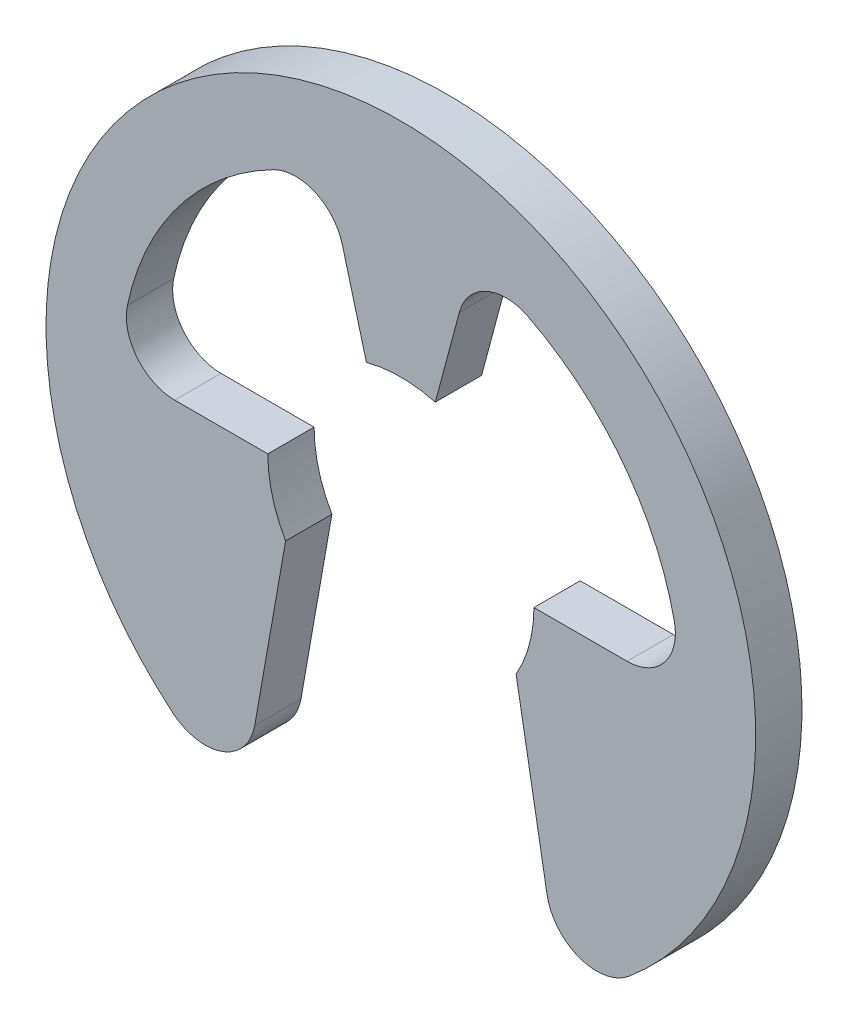
ISO-10303-21;
HEADER;
FILE_DESCRIPTION(('STEP AP214'),'2;1');
FILE_NAME('part.step','',(''),(''),'','','');
FILE_SCHEMA(('AUTOMOTIVE_DESIGN { 1 0 10303 214 1 1 1 1 }'));
ENDSEC;
DATA;
#1=APPLICATION_CONTEXT('core data for automotive mechanical design processes');
#2=APPLICATION_PROTOCOL_DEFINITION('international standard','automotive_design',2000,#1);
#3=PRODUCT_CONTEXT('',#1,'mechanical');
#4=PRODUCT('Part','Part','',(#3));
#5=PRODUCT_RELATED_PRODUCT_CATEGORY('part','',(#4));
#6=PRODUCT_DEFINITION_FORMATION('','',#4);
#7=PRODUCT_DEFINITION_CONTEXT('part definition',#1,'design');
#8=PRODUCT_DEFINITION('design','',#6,#7);
#9=PRODUCT_DEFINITION_SHAPE('','',#8);
#10=(LENGTH_UNIT() NAMED_UNIT(*) SI_UNIT(.MILLI.,.METRE.));
#11=(NAMED_UNIT(*) PLANE_ANGLE_UNIT() SI_UNIT($,.RADIAN.));
#12=(NAMED_UNIT(*) SI_UNIT($,.STERADIAN.) SOLID_ANGLE_UNIT());
#13=UNCERTAINTY_MEASURE_WITH_UNIT(LENGTH_MEASURE(1.E-05),#10,'distance_accuracy_value','');
#14=(GEOMETRIC_REPRESENTATION_CONTEXT(3) GLOBAL_UNCERTAINTY_ASSIGNED_CONTEXT((#13)) GLOBAL_UNIT_ASSIGNED_CONTEXT((#10,
#11,#12)) REPRESENTATION_CONTEXT('',''));
#15=CARTESIAN_POINT('',(0.,0.,0.));
#16=DIRECTION('',(0.,0.,1.));
#17=DIRECTION('',(1.,0.,0.));
#18=AXIS2_PLACEMENT_3D('',#15,#16,#17);
#19=CARTESIAN_POINT('',(1.95446781617003,0.418,-0.4));
#20=DIRECTION('',(0.,0.,1.));
#21=DIRECTION('',(1.,0.,0.));
#22=AXIS2_PLACEMENT_3D('',#19,#20,#21);
#23=CYLINDRICAL_SURFACE('',#22,0.418);
#24=CARTESIAN_POINT('',(1.95446781617003,0.418,0.));
#25=DIRECTION('',(0.,0.,-1.));
#26=DIRECTION('',(1.,0.,0.));
#27=AXIS2_PLACEMENT_3D('',#24,#25,#26);
#28=CIRCLE('',#27,0.418);
#29=CARTESIAN_POINT('',(2.36322409393474,0.505420280186791,0.));
#30=VERTEX_POINT('',#29);
#31=CARTESIAN_POINT('',(1.95446781617003,0.,0.));
#32=VERTEX_POINT('',#31);
#33=EDGE_CURVE('E189',#30,#32,#28,.T.);
#34=ORIENTED_EDGE('',*,*,#33,.F.);
#35=DIRECTION('',(0.,0.,1.));
#36=VECTOR('',#35,1.);
#37=CARTESIAN_POINT('',(2.36322409393474,0.505420280186791,-0.4));
#38=LINE('',#37,#36);
#39=CARTESIAN_POINT('',(2.36322409393474,0.505420280186791,-0.4));
#40=VERTEX_POINT('',#39);
#41=EDGE_CURVE('E11',#40,#30,#38,.T.);
#42=ORIENTED_EDGE('',*,*,#41,.F.);
#43=CARTESIAN_POINT('',(1.95446781617003,0.418,-0.4));
#44=DIRECTION('',(0.,0.,-1.));
#45=DIRECTION('',(1.,0.,0.));
#46=AXIS2_PLACEMENT_3D('',#43,#44,#45);
#47=CIRCLE('',#46,0.418);
#48=CARTESIAN_POINT('',(1.95446781617003,0.,-0.4));
#49=VERTEX_POINT('',#48);
#50=EDGE_CURVE('E239',#40,#49,#47,.T.);
#51=ORIENTED_EDGE('',*,*,#50,.T.);
#52=DIRECTION('',(0.,0.,1.));
#53=VECTOR('',#52,1.);
#54=CARTESIAN_POINT('',(1.95446781617003,0.,-0.4));
#55=LINE('',#54,#53);
#56=EDGE_CURVE('E35',#49,#32,#55,.T.);
#57=ORIENTED_EDGE('',*,*,#56,.T.);
#58=EDGE_LOOP('',(#34,#42,#51,#57));
#59=FACE_BOUND('',#58,.T.);
#60=ADVANCED_FACE('F32',(#59),#23,.F.);
#61=CARTESIAN_POINT('',(0.,0.,-0.4));
#62=DIRECTION('',(0.,0.,1.));
#63=DIRECTION('',(1.,0.,0.));
#64=AXIS2_PLACEMENT_3D('',#61,#62,#63);
#65=CYLINDRICAL_SURFACE('',#64,2.41666666666667);
#66=CARTESIAN_POINT('',(0.,0.,0.));
#67=DIRECTION('',(0.,0.,-1.));
#68=DIRECTION('',(1.,0.,0.));
#69=AXIS2_PLACEMENT_3D('',#66,#67,#68);
#70=CIRCLE('',#69,2.41666666666667);
#71=CARTESIAN_POINT('',(1.09984590511814,2.15188679134675,0.));
#72=VERTEX_POINT('',#71);
#73=EDGE_CURVE('E237',#72,#30,#70,.T.);
#74=ORIENTED_EDGE('',*,*,#73,.F.);
#75=DIRECTION('',(0.,0.,1.));
#76=VECTOR('',#75,1.);
#77=CARTESIAN_POINT('',(1.09984590511814,2.15188679134675,-0.4));
#78=LINE('',#77,#76);
#79=CARTESIAN_POINT('',(1.09984590511814,2.15188679134675,-0.4));
#80=VERTEX_POINT('',#79);
#81=EDGE_CURVE('E41',#80,#72,#78,.T.);
#82=ORIENTED_EDGE('',*,*,#81,.F.);
#83=CARTESIAN_POINT('',(0.,0.,-0.4));
#84=DIRECTION('',(0.,0.,-1.));
#85=DIRECTION('',(1.,0.,0.));
#86=AXIS2_PLACEMENT_3D('',#83,#84,#85);
#87=CIRCLE('',#86,2.41666666666667);
#88=EDGE_CURVE('E179',#80,#40,#87,.T.);
#89=ORIENTED_EDGE('',*,*,#88,.T.);
#90=ORIENTED_EDGE('',*,*,#41,.T.);
#91=EDGE_LOOP('',(#74,#82,#89,#90));
#92=FACE_BOUND('',#91,.T.);
#93=ADVANCED_FACE('F271',(#92),#65,.F.);
#94=CARTESIAN_POINT('',(0.909610489253568,1.77968457943657,-0.4));
#95=DIRECTION('',(0.,0.,1.));
#96=DIRECTION('',(1.,0.,0.));
#97=AXIS2_PLACEMENT_3D('',#94,#95,#96);
#98=CYLINDRICAL_SURFACE('',#97,0.418);
#99=CARTESIAN_POINT('',(0.909610489253568,1.77968457943657,0.));
#100=DIRECTION('',(0.,0.,-1.));
#101=DIRECTION('',(1.,0.,0.));
#102=AXIS2_PLACEMENT_3D('',#99,#100,#101);
#103=CIRCLE('',#102,0.418);
#104=CARTESIAN_POINT('',(0.505853493864737,1.88787094028943,0.));
#105=VERTEX_POINT('',#104);
#106=EDGE_CURVE('E166',#105,#72,#103,.T.);
#107=ORIENTED_EDGE('',*,*,#106,.F.);
#108=DIRECTION('',(0.,0.,1.));
#109=VECTOR('',#108,1.);
#110=CARTESIAN_POINT('',(0.505853493864737,1.88787094028943,-0.4));
#111=LINE('',#110,#109);
#112=CARTESIAN_POINT('',(0.505853493864737,1.88787094028943,-0.4));
#113=VERTEX_POINT('',#112);
#114=EDGE_CURVE('E161',#113,#105,#111,.T.);
#115=ORIENTED_EDGE('',*,*,#114,.F.);
#116=CARTESIAN_POINT('',(0.909610489253568,1.77968457943657,-0.4));
#117=DIRECTION('',(0.,0.,-1.));
#118=DIRECTION('',(1.,0.,0.));
#119=AXIS2_PLACEMENT_3D('',#116,#117,#118);
#120=CIRCLE('',#119,0.418);
#121=EDGE_CURVE('E164',#113,#80,#120,.T.);
#122=ORIENTED_EDGE('',*,*,#121,.T.);
#123=ORIENTED_EDGE('',*,*,#81,.T.);
#124=EDGE_LOOP('',(#107,#115,#122,#123));
#125=FACE_BOUND('',#124,.T.);
#126=ADVANCED_FACE('F163',(#125),#98,.F.);
#127=CARTESIAN_POINT('',(0.2976419018679,1.11081470023243,-0.4));
#128=DIRECTION('',(0.965925826289068,-0.258819045102522,0.));
#129=DIRECTION('',(0.258819045102522,0.965925826289068,0.));
#130=AXIS2_PLACEMENT_3D('',#127,#128,#129);
#131=PLANE('',#130);
#132=DIRECTION('',(0.258819045102522,0.965925826289068,0.));
#133=VECTOR('',#132,1.);
#134=CARTESIAN_POINT('',(0.2976419018679,1.11081470023243,0.));
#135=LINE('',#134,#133);
#136=CARTESIAN_POINT('',(0.2976419018679,1.11081470023243,0.));
#137=VERTEX_POINT('',#136);
#138=EDGE_CURVE('E234',#137,#105,#135,.T.);
#139=ORIENTED_EDGE('',*,*,#138,.F.);
#140=DIRECTION('',(0.,0.,1.));
#141=VECTOR('',#140,1.);
#142=CARTESIAN_POINT('',(0.2976419018679,1.11081470023243,-0.4));
#143=LINE('',#142,#141);
#144=CARTESIAN_POINT('',(0.2976419018679,1.11081470023243,-0.4));
#145=VERTEX_POINT('',#144);
#146=EDGE_CURVE('E171',#145,#137,#143,.T.);
#147=ORIENTED_EDGE('',*,*,#146,.F.);
#148=DIRECTION('',(0.258819045102522,0.965925826289068,0.));
#149=VECTOR('',#148,1.);
#150=CARTESIAN_POINT('',(0.2976419018679,1.11081470023243,-0.4));
#151=LINE('',#150,#149);
#152=EDGE_CURVE('E177',#145,#113,#151,.T.);
#153=ORIENTED_EDGE('',*,*,#152,.T.);
#154=ORIENTED_EDGE('',*,*,#114,.T.);
#155=EDGE_LOOP('',(#139,#147,#153,#154));
#156=FACE_BOUND('',#155,.T.);
#157=ADVANCED_FACE('F181',(#156),#131,.T.);
#158=CARTESIAN_POINT('',(0.,0.,-0.4));
#159=DIRECTION('',(0.,0.,1.));
#160=DIRECTION('',(1.,0.,0.));
#161=AXIS2_PLACEMENT_3D('',#158,#159,#160);
#162=CYLINDRICAL_SURFACE('',#161,1.15);
#163=CARTESIAN_POINT('',(0.,0.,0.));
#164=DIRECTION('',(0.,0.,-1.));
#165=DIRECTION('',(-1.,0.,0.));
#166=AXIS2_PLACEMENT_3D('',#163,#164,#165);
#167=CIRCLE('',#166,1.15);
#168=CARTESIAN_POINT('',(-0.2976419018679,1.11081470023243,0.));
#169=VERTEX_POINT('',#168);
#170=EDGE_CURVE('E231',#169,#137,#167,.T.);
#171=ORIENTED_EDGE('',*,*,#170,.F.);
#172=DIRECTION('',(0.,0.,1.));
#173=VECTOR('',#172,1.);
#174=CARTESIAN_POINT('',(-0.2976419018679,1.11081470023243,-0.4));
#175=LINE('',#174,#173);
#176=CARTESIAN_POINT('',(-0.2976419018679,1.11081470023243,-0.4));
#177=VERTEX_POINT('',#176);
#178=EDGE_CURVE('E243',#177,#169,#175,.T.);
#179=ORIENTED_EDGE('',*,*,#178,.F.);
#180=CARTESIAN_POINT('',(0.,0.,-0.4));
#181=DIRECTION('',(0.,0.,-1.));
#182=DIRECTION('',(-1.,0.,0.));
#183=AXIS2_PLACEMENT_3D('',#180,#181,#182);
#184=CIRCLE('',#183,1.15);
#185=EDGE_CURVE('E182',#177,#145,#184,.T.);
#186=ORIENTED_EDGE('',*,*,#185,.T.);
#187=ORIENTED_EDGE('',*,*,#146,.T.);
#188=EDGE_LOOP('',(#171,#179,#186,#187));
#189=FACE_BOUND('',#188,.T.);
#190=ADVANCED_FACE('F284',(#189),#162,.F.);
#191=CARTESIAN_POINT('',(-0.2976419018679,1.11081470023243,-0.4));
#192=DIRECTION('',(-0.965925826289068,-0.258819045102522,0.));
#193=DIRECTION('',(0.258819045102522,-0.965925826289068,0.));
#194=AXIS2_PLACEMENT_3D('',#191,#192,#193);
#195=PLANE('',#194);
#196=DIRECTION('',(0.258819045102522,-0.965925826289068,0.));
#197=VECTOR('',#196,1.);
#198=CARTESIAN_POINT('',(-0.2976419018679,1.11081470023243,0.));
#199=LINE('',#198,#197);
#200=CARTESIAN_POINT('',(-0.505853493864738,1.88787094028943,0.));
#201=VERTEX_POINT('',#200);
#202=EDGE_CURVE('E228',#201,#169,#199,.T.);
#203=ORIENTED_EDGE('',*,*,#202,.F.);
#204=DIRECTION('',(0.,0.,1.));
#205=VECTOR('',#204,1.);
#206=CARTESIAN_POINT('',(-0.505853493864738,1.88787094028943,-0.4));
#207=LINE('',#206,#205);
#208=CARTESIAN_POINT('',(-0.505853493864738,1.88787094028943,-0.4));
#209=VERTEX_POINT('',#208);
#210=EDGE_CURVE('E245',#209,#201,#207,.T.);
#211=ORIENTED_EDGE('',*,*,#210,.F.);
#212=DIRECTION('',(0.258819045102522,-0.965925826289068,0.));
#213=VECTOR('',#212,1.);
#214=CARTESIAN_POINT('',(-0.2976419018679,1.11081470023243,-0.4));
#215=LINE('',#214,#213);
#216=EDGE_CURVE('E184',#209,#177,#215,.T.);
#217=ORIENTED_EDGE('',*,*,#216,.T.);
#218=ORIENTED_EDGE('',*,*,#178,.T.);
#219=EDGE_LOOP('',(#203,#211,#217,#218));
#220=FACE_BOUND('',#219,.T.);
#221=ADVANCED_FACE('F287',(#220),#195,.T.);
#222=CARTESIAN_POINT('',(-0.909610489253568,1.77968457943657,-0.4));
#223=DIRECTION('',(0.,0.,1.));
#224=DIRECTION('',(1.,0.,0.));
#225=AXIS2_PLACEMENT_3D('',#222,#223,#224);
#226=CYLINDRICAL_SURFACE('',#225,0.418);
#227=CARTESIAN_POINT('',(-0.909610489253568,1.77968457943657,0.));
#228=DIRECTION('',(0.,0.,-1.));
#229=DIRECTION('',(1.,0.,0.));
#230=AXIS2_PLACEMENT_3D('',#227,#228,#229);
#231=CIRCLE('',#230,0.418);
#232=CARTESIAN_POINT('',(-1.09984590511814,2.15188679134675,0.));
#233=VERTEX_POINT('',#232);
#234=EDGE_CURVE('E225',#233,#201,#231,.T.);
#235=ORIENTED_EDGE('',*,*,#234,.F.);
#236=DIRECTION('',(0.,0.,1.));
#237=VECTOR('',#236,1.);
#238=CARTESIAN_POINT('',(-1.09984590511814,2.15188679134675,-0.4));
#239=LINE('',#238,#237);
#240=CARTESIAN_POINT('',(-1.09984590511814,2.15188679134675,-0.4));
#241=VERTEX_POINT('',#240);
#242=EDGE_CURVE('E247',#241,#233,#239,.T.);
#243=ORIENTED_EDGE('',*,*,#242,.F.);
#244=CARTESIAN_POINT('',(-0.909610489253568,1.77968457943657,-0.4));
#245=DIRECTION('',(0.,0.,-1.));
#246=DIRECTION('',(1.,0.,0.));
#247=AXIS2_PLACEMENT_3D('',#244,#245,#246);
#248=CIRCLE('',#247,0.418);
#249=EDGE_CURVE('E495',#241,#209,#248,.T.);
#250=ORIENTED_EDGE('',*,*,#249,.T.);
#251=ORIENTED_EDGE('',*,*,#210,.T.);
#252=EDGE_LOOP('',(#235,#243,#250,#251));
#253=FACE_BOUND('',#252,.T.);
#254=ADVANCED_FACE('F291',(#253),#226,.F.);
#255=CARTESIAN_POINT('',(0.,0.,-0.4));
#256=DIRECTION('',(0.,0.,1.));
#257=DIRECTION('',(1.,0.,0.));
#258=AXIS2_PLACEMENT_3D('',#255,#256,#257);
#259=CYLINDRICAL_SURFACE('',#258,2.41666666666667);
#260=CARTESIAN_POINT('',(0.,0.,0.));
#261=DIRECTION('',(0.,0.,-1.));
#262=DIRECTION('',(1.,0.,0.));
#263=AXIS2_PLACEMENT_3D('',#260,#261,#262);
#264=CIRCLE('',#263,2.41666666666667);
#265=CARTESIAN_POINT('',(-2.36322409393474,0.505420280186791,0.));
#266=VERTEX_POINT('',#265);
#267=EDGE_CURVE('E222',#266,#233,#264,.T.);
#268=ORIENTED_EDGE('',*,*,#267,.F.);
#269=DIRECTION('',(0.,0.,1.));
#270=VECTOR('',#269,1.);
#271=CARTESIAN_POINT('',(-2.36322409393474,0.505420280186791,-0.4));
#272=LINE('',#271,#270);
#273=CARTESIAN_POINT('',(-2.36322409393474,0.505420280186791,-0.4));
#274=VERTEX_POINT('',#273);
#275=EDGE_CURVE('E249',#274,#266,#272,.T.);
#276=ORIENTED_EDGE('',*,*,#275,.F.);
#277=CARTESIAN_POINT('',(0.,0.,-0.4));
#278=DIRECTION('',(0.,0.,-1.));
#279=DIRECTION('',(1.,0.,0.));
#280=AXIS2_PLACEMENT_3D('',#277,#278,#279);
#281=CIRCLE('',#280,2.41666666666667);
#282=EDGE_CURVE('E499',#274,#241,#281,.T.);
#283=ORIENTED_EDGE('',*,*,#282,.T.);
#284=ORIENTED_EDGE('',*,*,#242,.T.);
#285=EDGE_LOOP('',(#268,#276,#283,#284));
#286=FACE_BOUND('',#285,.T.);
#287=ADVANCED_FACE('F295',(#286),#259,.F.);
#288=CARTESIAN_POINT('',(-1.95446781617003,0.418,-0.4));
#289=DIRECTION('',(0.,0.,1.));
#290=DIRECTION('',(1.,0.,0.));
#291=AXIS2_PLACEMENT_3D('',#288,#289,#290);
#292=CYLINDRICAL_SURFACE('',#291,0.418);
#293=CARTESIAN_POINT('',(-1.95446781617003,0.418,0.));
#294=DIRECTION('',(0.,0.,-1.));
#295=DIRECTION('',(1.,0.,0.));
#296=AXIS2_PLACEMENT_3D('',#293,#294,#295);
#297=CIRCLE('',#296,0.418);
#298=CARTESIAN_POINT('',(-1.95446781617003,0.,0.));
#299=VERTEX_POINT('',#298);
#300=EDGE_CURVE('E219',#299,#266,#297,.T.);
#301=ORIENTED_EDGE('',*,*,#300,.F.);
#302=DIRECTION('',(0.,0.,1.));
#303=VECTOR('',#302,1.);
#304=CARTESIAN_POINT('',(-1.95446781617003,0.,-0.4));
#305=LINE('',#304,#303);
#306=CARTESIAN_POINT('',(-1.95446781617003,0.,-0.4));
#307=VERTEX_POINT('',#306);
#308=EDGE_CURVE('E251',#307,#299,#305,.T.);
#309=ORIENTED_EDGE('',*,*,#308,.F.);
#310=CARTESIAN_POINT('',(-1.95446781617003,0.418,-0.4));
#311=DIRECTION('',(0.,0.,-1.));
#312=DIRECTION('',(1.,0.,0.));
#313=AXIS2_PLACEMENT_3D('',#310,#311,#312);
#314=CIRCLE('',#313,0.418);
#315=EDGE_CURVE('E488',#307,#274,#314,.T.);
#316=ORIENTED_EDGE('',*,*,#315,.T.);
#317=ORIENTED_EDGE('',*,*,#275,.T.);
#318=EDGE_LOOP('',(#301,#309,#316,#317));
#319=FACE_BOUND('',#318,.T.);
#320=ADVANCED_FACE('F299',(#319),#292,.F.);
#321=CARTESIAN_POINT('',(-1.15,0.,-0.4));
#322=DIRECTION('',(0.,1.,0.));
#323=DIRECTION('',(-1.,0.,0.));
#324=AXIS2_PLACEMENT_3D('',#321,#322,#323);
#325=PLANE('',#324);
#326=DIRECTION('',(-1.,0.,0.));
#327=VECTOR('',#326,1.);
#328=CARTESIAN_POINT('',(-1.15,0.,0.));
#329=LINE('',#328,#327);
#330=CARTESIAN_POINT('',(-1.15,0.,0.));
#331=VERTEX_POINT('',#330);
#332=EDGE_CURVE('E216',#331,#299,#329,.T.);
#333=ORIENTED_EDGE('',*,*,#332,.F.);
#334=DIRECTION('',(0.,0.,1.));
#335=VECTOR('',#334,1.);
#336=CARTESIAN_POINT('',(-1.15,0.,-0.4));
#337=LINE('',#336,#335);
#338=CARTESIAN_POINT('',(-1.15,0.,-0.4));
#339=VERTEX_POINT('',#338);
#340=EDGE_CURVE('E253',#339,#331,#337,.T.);
#341=ORIENTED_EDGE('',*,*,#340,.F.);
#342=DIRECTION('',(-1.,0.,0.));
#343=VECTOR('',#342,1.);
#344=CARTESIAN_POINT('',(-1.15,0.,-0.4));
#345=LINE('',#344,#343);
#346=EDGE_CURVE('E484',#339,#307,#345,.T.);
#347=ORIENTED_EDGE('',*,*,#346,.T.);
#348=ORIENTED_EDGE('',*,*,#308,.T.);
#349=EDGE_LOOP('',(#333,#341,#347,#348));
#350=FACE_BOUND('',#349,.T.);
#351=ADVANCED_FACE('F303',(#350),#325,.T.);
#352=CARTESIAN_POINT('',(0.,0.,-0.4));
#353=DIRECTION('',(0.,0.,1.));
#354=DIRECTION('',(1.,0.,0.));
#355=AXIS2_PLACEMENT_3D('',#352,#353,#354);
#356=CYLINDRICAL_SURFACE('',#355,1.15);
#357=CARTESIAN_POINT('',(0.,0.,0.));
#358=DIRECTION('',(0.,0.,-1.));
#359=DIRECTION('',(1.,0.,0.));
#360=AXIS2_PLACEMENT_3D('',#357,#358,#359);
#361=CIRCLE('',#360,1.15);
#362=CARTESIAN_POINT('',(-0.995929214352104,-0.575000000000001,0.));
#363=VERTEX_POINT('',#362);
#364=EDGE_CURVE('E213',#363,#331,#361,.T.);
#365=ORIENTED_EDGE('',*,*,#364,.F.);
#366=DIRECTION('',(0.,0.,1.));
#367=VECTOR('',#366,1.);
#368=CARTESIAN_POINT('',(-0.995929214352104,-0.575000000000001,-0.4));
#369=LINE('',#368,#367);
#370=CARTESIAN_POINT('',(-0.995929214352104,-0.575000000000001,-0.4));
#371=VERTEX_POINT('',#370);
#372=EDGE_CURVE('E255',#371,#363,#369,.T.);
#373=ORIENTED_EDGE('',*,*,#372,.F.);
#374=CARTESIAN_POINT('',(0.,0.,-0.4));
#375=DIRECTION('',(0.,0.,-1.));
#376=DIRECTION('',(1.,0.,0.));
#377=AXIS2_PLACEMENT_3D('',#374,#375,#376);
#378=CIRCLE('',#377,1.15);
#379=EDGE_CURVE('E505',#371,#339,#378,.T.);
#380=ORIENTED_EDGE('',*,*,#379,.T.);
#381=ORIENTED_EDGE('',*,*,#340,.T.);
#382=EDGE_LOOP('',(#365,#373,#380,#381));
#383=FACE_BOUND('',#382,.T.);
#384=ADVANCED_FACE('F307',(#383),#356,.F.);
#385=CARTESIAN_POINT('',(-0.995929214352104,-0.575000000000001,-0.4));
#386=DIRECTION('',(0.984807753012208,-0.17364817766693,0.));
#387=DIRECTION('',(0.17364817766693,0.984807753012208,0.));
#388=AXIS2_PLACEMENT_3D('',#385,#386,#387);
#389=PLANE('',#388);
#390=DIRECTION('',(0.17364817766693,0.984807753012208,0.));
#391=VECTOR('',#390,1.);
#392=CARTESIAN_POINT('',(-0.995929214352104,-0.575000000000001,0.));
#393=LINE('',#392,#391);
#394=CARTESIAN_POINT('',(-1.26316511081154,-2.09057008113962,0.));
#395=VERTEX_POINT('',#394);
#396=EDGE_CURVE('E210',#395,#363,#393,.T.);
#397=ORIENTED_EDGE('',*,*,#396,.F.);
#398=DIRECTION('',(0.,0.,1.));
#399=VECTOR('',#398,1.);
#400=CARTESIAN_POINT('',(-1.26316511081154,-2.09057008113962,-0.4));
#401=LINE('',#400,#399);
#402=CARTESIAN_POINT('',(-1.26316511081154,-2.09057008113962,-0.4));
#403=VERTEX_POINT('',#402);
#404=EDGE_CURVE('E257',#403,#395,#401,.T.);
#405=ORIENTED_EDGE('',*,*,#404,.F.);
#406=DIRECTION('',(0.17364817766693,0.984807753012208,0.));
#407=VECTOR('',#406,1.);
#408=CARTESIAN_POINT('',(-0.995929214352104,-0.575000000000001,-0.4));
#409=LINE('',#408,#407);
#410=EDGE_CURVE('E477',#403,#371,#409,.T.);
#411=ORIENTED_EDGE('',*,*,#410,.T.);
#412=ORIENTED_EDGE('',*,*,#372,.T.);
#413=EDGE_LOOP('',(#397,#405,#411,#412));
#414=FACE_BOUND('',#413,.T.);
#415=ADVANCED_FACE('F311',(#414),#389,.T.);
#416=CARTESIAN_POINT('',(-1.69204888724835,-2.01494629976567,-0.4));
#417=DIRECTION('',(0.,0.,1.));
#418=DIRECTION('',(1.,0.,0.));
#419=AXIS2_PLACEMENT_3D('',#416,#417,#418);
#420=CYLINDRICAL_SURFACE('',#419,0.4355);
#421=CARTESIAN_POINT('',(-1.69204888724835,-2.01494629976567,0.));
#422=DIRECTION('',(0.,0.,1.));
#423=DIRECTION('',(1.,0.,0.));
#424=AXIS2_PLACEMENT_3D('',#421,#422,#423);
#425=CIRCLE('',#424,0.4355);
#426=CARTESIAN_POINT('',(-1.97210993382971,-2.34845201214217,0.));
#427=VERTEX_POINT('',#426);
#428=EDGE_CURVE('E207',#427,#395,#425,.T.);
#429=ORIENTED_EDGE('',*,*,#428,.F.);
#430=DIRECTION('',(0.,0.,1.));
#431=VECTOR('',#430,1.);
#432=CARTESIAN_POINT('',(-1.97210993382971,-2.34845201214217,-0.4));
#433=LINE('',#432,#431);
#434=CARTESIAN_POINT('',(-1.97210993382971,-2.34845201214217,-0.4));
#435=VERTEX_POINT('',#434);
#436=EDGE_CURVE('E259',#435,#427,#433,.T.);
#437=ORIENTED_EDGE('',*,*,#436,.F.);
#438=CARTESIAN_POINT('',(-1.69204888724835,-2.01494629976567,-0.4));
#439=DIRECTION('',(0.,0.,1.));
#440=DIRECTION('',(1.,0.,0.));
#441=AXIS2_PLACEMENT_3D('',#438,#439,#440);
#442=CIRCLE('',#441,0.4355);
#443=EDGE_CURVE('E473',#435,#403,#442,.T.);
#444=ORIENTED_EDGE('',*,*,#443,.T.);
#445=ORIENTED_EDGE('',*,*,#404,.T.);
#446=EDGE_LOOP('',(#429,#437,#444,#445));
#447=FACE_BOUND('',#446,.T.);
#448=ADVANCED_FACE('F315',(#447),#420,.T.);
#449=CARTESIAN_POINT('',(0.,0.,-0.4));
#450=DIRECTION('',(0.,0.,1.));
#451=DIRECTION('',(1.,0.,0.));
#452=AXIS2_PLACEMENT_3D('',#449,#450,#451);
#453=CYLINDRICAL_SURFACE('',#452,3.06666666666667);
#454=CARTESIAN_POINT('',(0.,0.,0.));
#455=DIRECTION('',(0.,0.,1.));
#456=DIRECTION('',(1.,0.,0.));
#457=AXIS2_PLACEMENT_3D('',#454,#455,#456);
#458=CIRCLE('',#457,3.06666666666667);
#459=CARTESIAN_POINT('',(1.97210993382971,-2.34845201214217,0.));
#460=VERTEX_POINT('',#459);
#461=EDGE_CURVE('E204',#460,#427,#458,.T.);
#462=ORIENTED_EDGE('',*,*,#461,.F.);
#463=DIRECTION('',(0.,0.,1.));
#464=VECTOR('',#463,1.);
#465=CARTESIAN_POINT('',(1.97210993382971,-2.34845201214217,-0.4));
#466=LINE('',#465,#464);
#467=CARTESIAN_POINT('',(1.97210993382971,-2.34845201214217,-0.4));
#468=VERTEX_POINT('',#467);
#469=EDGE_CURVE('E261',#468,#460,#466,.T.);
#470=ORIENTED_EDGE('',*,*,#469,.F.);
#471=CARTESIAN_POINT('',(0.,0.,-0.4));
#472=DIRECTION('',(0.,0.,1.));
#473=DIRECTION('',(1.,0.,0.));
#474=AXIS2_PLACEMENT_3D('',#471,#472,#473);
#475=CIRCLE('',#474,3.06666666666667);
#476=EDGE_CURVE('E509',#468,#435,#475,.T.);
#477=ORIENTED_EDGE('',*,*,#476,.T.);
#478=ORIENTED_EDGE('',*,*,#436,.T.);
#479=EDGE_LOOP('',(#462,#470,#477,#478));
#480=FACE_BOUND('',#479,.T.);
#481=ADVANCED_FACE('F319',(#480),#453,.T.);
#482=CARTESIAN_POINT('',(1.69204888724835,-2.01494629976567,-0.4));
#483=DIRECTION('',(0.,0.,1.));
#484=DIRECTION('',(1.,0.,0.));
#485=AXIS2_PLACEMENT_3D('',#482,#483,#484);
#486=CYLINDRICAL_SURFACE('',#485,0.4355);
#487=CARTESIAN_POINT('',(1.69204888724835,-2.01494629976567,0.));
#488=DIRECTION('',(0.,0.,1.));
#489=DIRECTION('',(1.,0.,0.));
#490=AXIS2_PLACEMENT_3D('',#487,#488,#489);
#491=CIRCLE('',#490,0.4355);
#492=CARTESIAN_POINT('',(1.26316511081154,-2.09057008113962,0.));
#493=VERTEX_POINT('',#492);
#494=EDGE_CURVE('E201',#493,#460,#491,.T.);
#495=ORIENTED_EDGE('',*,*,#494,.F.);
#496=DIRECTION('',(0.,0.,1.));
#497=VECTOR('',#496,1.);
#498=CARTESIAN_POINT('',(1.26316511081154,-2.09057008113962,-0.4));
#499=LINE('',#498,#497);
#500=CARTESIAN_POINT('',(1.26316511081154,-2.09057008113962,-0.4));
#501=VERTEX_POINT('',#500);
#502=EDGE_CURVE('E263',#501,#493,#499,.T.);
#503=ORIENTED_EDGE('',*,*,#502,.F.);
#504=CARTESIAN_POINT('',(1.69204888724835,-2.01494629976567,-0.4));
#505=DIRECTION('',(0.,0.,1.));
#506=DIRECTION('',(1.,0.,0.));
#507=AXIS2_PLACEMENT_3D('',#504,#505,#506);
#508=CIRCLE('',#507,0.4355);
#509=EDGE_CURVE('E466',#501,#468,#508,.T.);
#510=ORIENTED_EDGE('',*,*,#509,.T.);
#511=ORIENTED_EDGE('',*,*,#469,.T.);
#512=EDGE_LOOP('',(#495,#503,#510,#511));
#513=FACE_BOUND('',#512,.T.);
#514=ADVANCED_FACE('F323',(#513),#486,.T.);
#515=CARTESIAN_POINT('',(0.995929214352104,-0.575000000000001,-0.4));
#516=DIRECTION('',(-0.984807753012208,-0.17364817766693,0.));
#517=DIRECTION('',(0.17364817766693,-0.984807753012208,0.));
#518=AXIS2_PLACEMENT_3D('',#515,#516,#517);
#519=PLANE('',#518);
#520=DIRECTION('',(0.17364817766693,-0.984807753012208,0.));
#521=VECTOR('',#520,1.);
#522=CARTESIAN_POINT('',(0.995929214352104,-0.575000000000001,0.));
#523=LINE('',#522,#521);
#524=CARTESIAN_POINT('',(0.995929214352104,-0.575000000000001,0.));
#525=VERTEX_POINT('',#524);
#526=EDGE_CURVE('E198',#525,#493,#523,.T.);
#527=ORIENTED_EDGE('',*,*,#526,.F.);
#528=DIRECTION('',(0.,0.,1.));
#529=VECTOR('',#528,1.);
#530=CARTESIAN_POINT('',(0.995929214352104,-0.575000000000001,-0.4));
#531=LINE('',#530,#529);
#532=CARTESIAN_POINT('',(0.995929214352104,-0.575000000000001,-0.4));
#533=VERTEX_POINT('',#532);
#534=EDGE_CURVE('E265',#533,#525,#531,.T.);
#535=ORIENTED_EDGE('',*,*,#534,.F.);
#536=DIRECTION('',(0.17364817766693,-0.984807753012208,0.));
#537=VECTOR('',#536,1.);
#538=CARTESIAN_POINT('',(0.995929214352104,-0.575000000000001,-0.4));
#539=LINE('',#538,#537);
#540=EDGE_CURVE('E462',#533,#501,#539,.T.);
#541=ORIENTED_EDGE('',*,*,#540,.T.);
#542=ORIENTED_EDGE('',*,*,#502,.T.);
#543=EDGE_LOOP('',(#527,#535,#541,#542));
#544=FACE_BOUND('',#543,.T.);
#545=ADVANCED_FACE('F327',(#544),#519,.T.);
#546=CARTESIAN_POINT('',(0.,0.,-0.4));
#547=DIRECTION('',(0.,0.,1.));
#548=DIRECTION('',(1.,0.,0.));
#549=AXIS2_PLACEMENT_3D('',#546,#547,#548);
#550=CYLINDRICAL_SURFACE('',#549,1.15);
#551=CARTESIAN_POINT('',(0.,0.,0.));
#552=DIRECTION('',(0.,0.,-1.));
#553=DIRECTION('',(1.,0.,0.));
#554=AXIS2_PLACEMENT_3D('',#551,#552,#553);
#555=CIRCLE('',#554,1.15);
#556=CARTESIAN_POINT('',(1.15,0.,0.));
#557=VERTEX_POINT('',#556);
#558=EDGE_CURVE('E195',#557,#525,#555,.T.);
#559=ORIENTED_EDGE('',*,*,#558,.F.);
#560=DIRECTION('',(0.,0.,1.));
#561=VECTOR('',#560,1.);
#562=CARTESIAN_POINT('',(1.15,0.,-0.4));
#563=LINE('',#562,#561);
#564=CARTESIAN_POINT('',(1.15,0.,-0.4));
#565=VERTEX_POINT('',#564);
#566=EDGE_CURVE('E266',#565,#557,#563,.T.);
#567=ORIENTED_EDGE('',*,*,#566,.F.);
#568=CARTESIAN_POINT('',(0.,0.,-0.4));
#569=DIRECTION('',(0.,0.,-1.));
#570=DIRECTION('',(1.,0.,0.));
#571=AXIS2_PLACEMENT_3D('',#568,#569,#570);
#572=CIRCLE('',#571,1.15);
#573=EDGE_CURVE('E513',#565,#533,#572,.T.);
#574=ORIENTED_EDGE('',*,*,#573,.T.);
#575=ORIENTED_EDGE('',*,*,#534,.T.);
#576=EDGE_LOOP('',(#559,#567,#574,#575));
#577=FACE_BOUND('',#576,.T.);
#578=ADVANCED_FACE('F331',(#577),#550,.F.);
#579=CARTESIAN_POINT('',(1.15,0.,-0.4));
#580=DIRECTION('',(0.,1.,0.));
#581=DIRECTION('',(0.,0.,1.));
#582=AXIS2_PLACEMENT_3D('',#579,#580,#581);
#583=PLANE('',#582);
#584=DIRECTION('',(-1.,0.,0.));
#585=VECTOR('',#584,1.);
#586=CARTESIAN_POINT('',(1.15,0.,0.));
#587=LINE('',#586,#585);
#588=EDGE_CURVE('E192',#32,#557,#587,.T.);
#589=ORIENTED_EDGE('',*,*,#588,.F.);
#590=ORIENTED_EDGE('',*,*,#56,.F.);
#591=DIRECTION('',(-1.,0.,0.));
#592=VECTOR('',#591,1.);
#593=CARTESIAN_POINT('',(1.15,0.,-0.4));
#594=LINE('',#593,#592);
#595=EDGE_CURVE('E515',#49,#565,#594,.T.);
#596=ORIENTED_EDGE('',*,*,#595,.T.);
#597=ORIENTED_EDGE('',*,*,#566,.T.);
#598=EDGE_LOOP('',(#589,#590,#596,#597));
#599=FACE_BOUND('',#598,.T.);
#600=ADVANCED_FACE('F268',(#599),#583,.T.);
#601=CARTESIAN_POINT('',(1.95446781617003,0.418,-0.4));
#602=DIRECTION('',(0.,0.,1.));
#603=DIRECTION('',(1.,0.,0.));
#604=AXIS2_PLACEMENT_3D('',#601,#602,#603);
#605=PLANE('',#604);
#606=ORIENTED_EDGE('',*,*,#50,.F.);
#607=ORIENTED_EDGE('',*,*,#88,.F.);
#608=ORIENTED_EDGE('',*,*,#121,.F.);
#609=ORIENTED_EDGE('',*,*,#152,.F.);
#610=ORIENTED_EDGE('',*,*,#185,.F.);
#611=ORIENTED_EDGE('',*,*,#216,.F.);
#612=ORIENTED_EDGE('',*,*,#249,.F.);
#613=ORIENTED_EDGE('',*,*,#282,.F.);
#614=ORIENTED_EDGE('',*,*,#315,.F.);
#615=ORIENTED_EDGE('',*,*,#346,.F.);
#616=ORIENTED_EDGE('',*,*,#379,.F.);
#617=ORIENTED_EDGE('',*,*,#410,.F.);
#618=ORIENTED_EDGE('',*,*,#443,.F.);
#619=ORIENTED_EDGE('',*,*,#476,.F.);
#620=ORIENTED_EDGE('',*,*,#509,.F.);
#621=ORIENTED_EDGE('',*,*,#540,.F.);
#622=ORIENTED_EDGE('',*,*,#573,.F.);
#623=ORIENTED_EDGE('',*,*,#595,.F.);
#624=EDGE_LOOP('',(#606,#607,#608,#609,#610,#611,#612,#613,#614,#615,#616,#617,#618,#619,#620,
#621,#622,#623));
#625=FACE_BOUND('',#624,.T.);
#626=ADVANCED_FACE('F175',(#625),#605,.F.);
#627=CARTESIAN_POINT('',(1.95446781617003,0.418,0.));
#628=DIRECTION('',(0.,0.,1.));
#629=DIRECTION('',(1.,0.,0.));
#630=AXIS2_PLACEMENT_3D('',#627,#628,#629);
#631=PLANE('',#630);
#632=ORIENTED_EDGE('',*,*,#33,.T.);
#633=ORIENTED_EDGE('',*,*,#588,.T.);
#634=ORIENTED_EDGE('',*,*,#558,.T.);
#635=ORIENTED_EDGE('',*,*,#526,.T.);
#636=ORIENTED_EDGE('',*,*,#494,.T.);
#637=ORIENTED_EDGE('',*,*,#461,.T.);
#638=ORIENTED_EDGE('',*,*,#428,.T.);
#639=ORIENTED_EDGE('',*,*,#396,.T.);
#640=ORIENTED_EDGE('',*,*,#364,.T.);
#641=ORIENTED_EDGE('',*,*,#332,.T.);
#642=ORIENTED_EDGE('',*,*,#300,.T.);
#643=ORIENTED_EDGE('',*,*,#267,.T.);
#644=ORIENTED_EDGE('',*,*,#234,.T.);
#645=ORIENTED_EDGE('',*,*,#202,.T.);
#646=ORIENTED_EDGE('',*,*,#170,.T.);
#647=ORIENTED_EDGE('',*,*,#138,.T.);
#648=ORIENTED_EDGE('',*,*,#106,.T.);
#649=ORIENTED_EDGE('',*,*,#73,.T.);
#650=EDGE_LOOP('',(#632,#633,#634,#635,#636,#637,#638,#639,#640,#641,#642,#643,#644,#645,#646,
#647,#648,#649));
#651=FACE_BOUND('',#650,.T.);
#652=ADVANCED_FACE('F270',(#651),#631,.T.);
#653=CLOSED_SHELL('',(#60,#93,#126,#157,#190,#221,#254,#287,#320,#351,#384,#415,#448,#481,#514,
#545,#578,#600,#626,#652));
#654=MANIFOLD_SOLID_BREP('B2',#653);
#655=ADVANCED_BREP_SHAPE_REPRESENTATION('',(#18,#654),#14);
#656=SHAPE_DEFINITION_REPRESENTATION(#9,#655);
ENDSEC;
END-ISO-10303-21;
